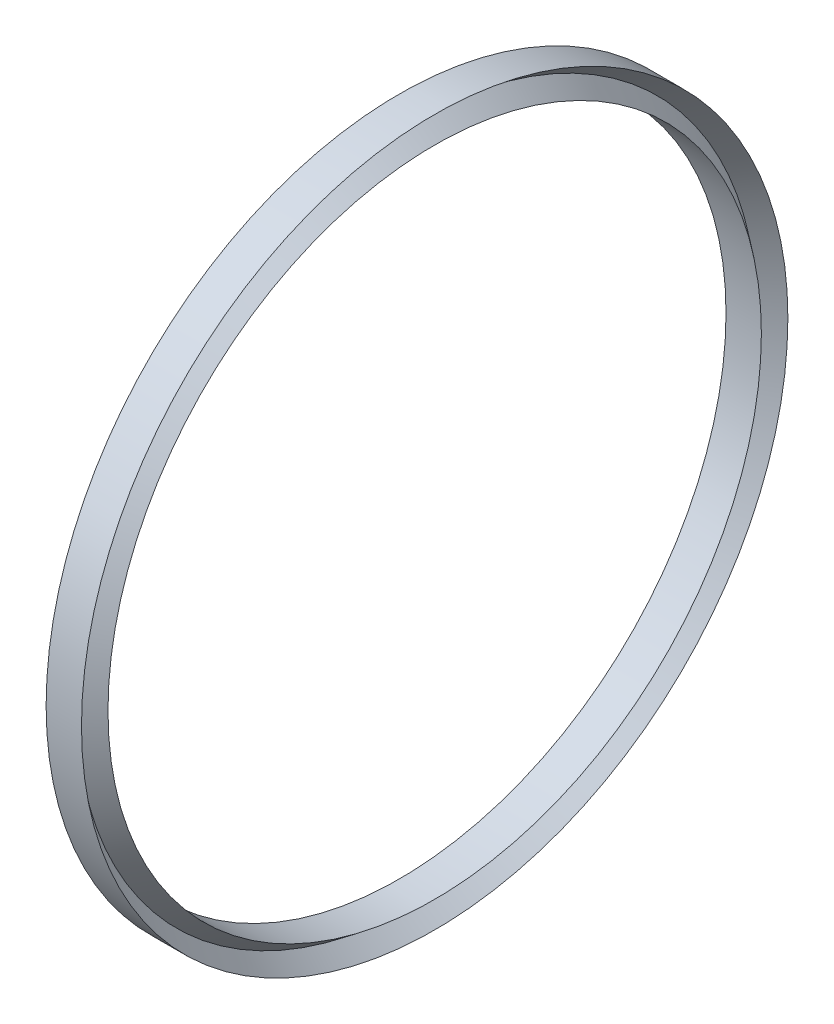
ISO-10303-21;
HEADER;
FILE_DESCRIPTION(('STEP AP214'),'2;1');
FILE_NAME('part.step','',(''),(''),'','','');
FILE_SCHEMA(('AUTOMOTIVE_DESIGN { 1 0 10303 214 1 1 1 1 }'));
ENDSEC;
DATA;
#1=APPLICATION_CONTEXT('core data for automotive mechanical design processes');
#2=APPLICATION_PROTOCOL_DEFINITION('international standard','automotive_design',2000,#1);
#3=PRODUCT_CONTEXT('',#1,'mechanical');
#4=PRODUCT('Part','Part','',(#3));
#5=PRODUCT_RELATED_PRODUCT_CATEGORY('part','',(#4));
#6=PRODUCT_DEFINITION_FORMATION('','',#4);
#7=PRODUCT_DEFINITION_CONTEXT('part definition',#1,'design');
#8=PRODUCT_DEFINITION('design','',#6,#7);
#9=PRODUCT_DEFINITION_SHAPE('','',#8);
#10=(LENGTH_UNIT() NAMED_UNIT(*) SI_UNIT(.MILLI.,.METRE.));
#11=(NAMED_UNIT(*) PLANE_ANGLE_UNIT() SI_UNIT($,.RADIAN.));
#12=(NAMED_UNIT(*) SI_UNIT($,.STERADIAN.) SOLID_ANGLE_UNIT());
#13=UNCERTAINTY_MEASURE_WITH_UNIT(LENGTH_MEASURE(1.E-05),#10,'distance_accuracy_value','');
#14=(GEOMETRIC_REPRESENTATION_CONTEXT(3) GLOBAL_UNCERTAINTY_ASSIGNED_CONTEXT((#13)) GLOBAL_UNIT_ASSIGNED_CONTEXT((#10,
#11,#12)) REPRESENTATION_CONTEXT('',''));
#15=CARTESIAN_POINT('',(0.,0.,0.));
#16=DIRECTION('',(0.,0.,1.));
#17=DIRECTION('',(1.,0.,0.));
#18=AXIS2_PLACEMENT_3D('',#15,#16,#17);
#19=CARTESIAN_POINT('',(-65.8314235751511,0.,0.));
#20=DIRECTION('',(1.,0.,0.));
#21=DIRECTION('',(0.,0.,-1.));
#22=AXIS2_PLACEMENT_3D('',#19,#20,#21);
#23=CONICAL_SURFACE('',#22,38.5,0.643501108793283);
#24=CARTESIAN_POINT('',(-63.8300902418178,0.,0.));
#25=DIRECTION('',(-1.,0.,0.));
#26=DIRECTION('',(0.,0.,1.));
#27=AXIS2_PLACEMENT_3D('',#24,#25,#26);
#28=CIRCLE('',#27,40.001);
#29=CARTESIAN_POINT('',(-63.8300902418178,0.,40.001));
#30=VERTEX_POINT('',#29);
#31=EDGE_CURVE('E10',#30,#30,#28,.T.);
#32=ORIENTED_EDGE('',*,*,#31,.F.);
#33=EDGE_LOOP('',(#32));
#34=FACE_BOUND('',#33,.T.);
#35=CARTESIAN_POINT('',(-65.8314235751511,0.,0.));
#36=DIRECTION('',(-1.,0.,0.));
#37=DIRECTION('',(0.,0.,1.));
#38=AXIS2_PLACEMENT_3D('',#35,#36,#37);
#39=CIRCLE('',#38,38.5);
#40=CARTESIAN_POINT('',(-65.8314235751511,0.,38.5));
#41=VERTEX_POINT('',#40);
#42=EDGE_CURVE('E61',#41,#41,#39,.T.);
#43=ORIENTED_EDGE('',*,*,#42,.T.);
#44=EDGE_LOOP('',(#43));
#45=FACE_BOUND('',#44,.T.);
#46=ADVANCED_FACE('F35',(#34,#45),#23,.F.);
#47=CARTESIAN_POINT('',(-81.57816751546,0.,0.));
#48=DIRECTION('',(-1.,0.,0.));
#49=DIRECTION('',(0.,0.,1.));
#50=AXIS2_PLACEMENT_3D('',#47,#48,#49);
#51=CYLINDRICAL_SURFACE('',#50,40.001);
#52=ORIENTED_EDGE('',*,*,#31,.T.);
#53=EDGE_LOOP('',(#52));
#54=FACE_BOUND('',#53,.T.);
#55=CARTESIAN_POINT('',(-67.8340902418178,0.,0.));
#56=DIRECTION('',(-1.,0.,0.));
#57=DIRECTION('',(0.,0.,1.));
#58=AXIS2_PLACEMENT_3D('',#55,#56,#57);
#59=CIRCLE('',#58,40.001);
#60=CARTESIAN_POINT('',(-67.8340902418178,0.,40.001));
#61=VERTEX_POINT('',#60);
#62=EDGE_CURVE('E42',#61,#61,#59,.T.);
#63=ORIENTED_EDGE('',*,*,#62,.F.);
#64=EDGE_LOOP('',(#63));
#65=FACE_BOUND('',#64,.T.);
#66=ADVANCED_FACE('F115',(#54,#65),#51,.T.);
#67=CARTESIAN_POINT('',(-67.8340902418178,0.,0.));
#68=DIRECTION('',(-1.,0.,0.));
#69=DIRECTION('',(0.,0.,1.));
#70=AXIS2_PLACEMENT_3D('',#67,#68,#69);
#71=PLANE('',#70);
#72=ORIENTED_EDGE('',*,*,#62,.T.);
#73=EDGE_LOOP('',(#72));
#74=FACE_BOUND('',#73,.T.);
#75=CARTESIAN_POINT('',(-67.8340902418178,0.,0.));
#76=DIRECTION('',(-1.,0.,0.));
#77=DIRECTION('',(0.,0.,1.));
#78=AXIS2_PLACEMENT_3D('',#75,#76,#77);
#79=CIRCLE('',#78,36.999);
#80=CARTESIAN_POINT('',(-67.8340902418178,0.,36.999));
#81=VERTEX_POINT('',#80);
#82=EDGE_CURVE('E49',#81,#81,#79,.T.);
#83=ORIENTED_EDGE('',*,*,#82,.F.);
#84=EDGE_LOOP('',(#83));
#85=FACE_BOUND('',#84,.T.);
#86=ADVANCED_FACE('F112',(#74,#85),#71,.T.);
#87=CARTESIAN_POINT('',(-81.57816751546,0.,0.));
#88=DIRECTION('',(-1.,0.,0.));
#89=DIRECTION('',(0.,0.,1.));
#90=AXIS2_PLACEMENT_3D('',#87,#88,#89);
#91=CYLINDRICAL_SURFACE('',#90,36.999);
#92=ORIENTED_EDGE('',*,*,#82,.T.);
#93=EDGE_LOOP('',(#92));
#94=FACE_BOUND('',#93,.T.);
#95=CARTESIAN_POINT('',(-63.8300902418178,0.,0.));
#96=DIRECTION('',(-1.,0.,0.));
#97=DIRECTION('',(0.,0.,1.));
#98=AXIS2_PLACEMENT_3D('',#95,#96,#97);
#99=CIRCLE('',#98,36.999);
#100=CARTESIAN_POINT('',(-63.8300902418178,0.,36.999));
#101=VERTEX_POINT('',#100);
#102=EDGE_CURVE('E55',#101,#101,#99,.T.);
#103=ORIENTED_EDGE('',*,*,#102,.F.);
#104=EDGE_LOOP('',(#103));
#105=FACE_BOUND('',#104,.T.);
#106=ADVANCED_FACE('F108',(#94,#105),#91,.F.);
#107=CARTESIAN_POINT('',(-63.8300902418178,0.,0.));
#108=DIRECTION('',(-1.,0.,0.));
#109=DIRECTION('',(0.,0.,1.));
#110=AXIS2_PLACEMENT_3D('',#107,#108,#109);
#111=CONICAL_SURFACE('',#110,36.999,0.643501108793283);
#112=ORIENTED_EDGE('',*,*,#42,.F.);
#113=EDGE_LOOP('',(#112));
#114=FACE_BOUND('',#113,.T.);
#115=ORIENTED_EDGE('',*,*,#102,.T.);
#116=EDGE_LOOP('',(#115));
#117=FACE_BOUND('',#116,.T.);
#118=ADVANCED_FACE('F106',(#114,#117),#111,.T.);
#119=CLOSED_SHELL('',(#46,#66,#86,#106,#118));
#120=CARTESIAN_POINT('',(-65.8330902418178,0.,0.));
#121=DIRECTION('',(1.,0.,0.));
#122=DIRECTION('',(0.,0.,-1.));
#123=AXIS2_PLACEMENT_3D('',#120,#121,#122);
#124=CONICAL_SURFACE('',#123,38.5,0.643501108793284);
#125=CARTESIAN_POINT('',(-63.8330902418178,0.,0.));
#126=DIRECTION('',(-1.,0.,0.));
#127=DIRECTION('',(0.,0.,1.));
#128=AXIS2_PLACEMENT_3D('',#125,#126,#127);
#129=CIRCLE('',#128,40.);
#130=CARTESIAN_POINT('',(-63.8330902418178,0.,40.));
#131=VERTEX_POINT('',#130);
#132=EDGE_CURVE('E65',#131,#131,#129,.T.);
#133=ORIENTED_EDGE('',*,*,#132,.T.);
#134=EDGE_LOOP('',(#133));
#135=FACE_BOUND('',#134,.T.);
#136=CARTESIAN_POINT('',(-65.8330902418178,0.,0.));
#137=DIRECTION('',(-1.,0.,0.));
#138=DIRECTION('',(0.,0.,1.));
#139=AXIS2_PLACEMENT_3D('',#136,#137,#138);
#140=CIRCLE('',#139,38.5);
#141=CARTESIAN_POINT('',(-65.8330902418178,0.,38.5));
#142=VERTEX_POINT('',#141);
#143=EDGE_CURVE('E81',#142,#142,#140,.T.);
#144=ORIENTED_EDGE('',*,*,#143,.F.);
#145=EDGE_LOOP('',(#144));
#146=FACE_BOUND('',#145,.T.);
#147=ADVANCED_FACE('F90',(#135,#146),#124,.T.);
#148=CARTESIAN_POINT('',(-81.57816751546,0.,0.));
#149=DIRECTION('',(-1.,0.,0.));
#150=DIRECTION('',(0.,0.,1.));
#151=AXIS2_PLACEMENT_3D('',#148,#149,#150);
#152=CYLINDRICAL_SURFACE('',#151,40.);
#153=ORIENTED_EDGE('',*,*,#132,.F.);
#154=EDGE_LOOP('',(#153));
#155=FACE_BOUND('',#154,.T.);
#156=CARTESIAN_POINT('',(-67.8330902418178,0.,0.));
#157=DIRECTION('',(-1.,0.,0.));
#158=DIRECTION('',(0.,0.,1.));
#159=AXIS2_PLACEMENT_3D('',#156,#157,#158);
#160=CIRCLE('',#159,40.);
#161=CARTESIAN_POINT('',(-67.8330902418178,0.,40.));
#162=VERTEX_POINT('',#161);
#163=EDGE_CURVE('E69',#162,#162,#160,.T.);
#164=ORIENTED_EDGE('',*,*,#163,.T.);
#165=EDGE_LOOP('',(#164));
#166=FACE_BOUND('',#165,.T.);
#167=ADVANCED_FACE('F92',(#155,#166),#152,.F.);
#168=CARTESIAN_POINT('',(-67.8330902418178,0.,0.));
#169=DIRECTION('',(-1.,0.,0.));
#170=DIRECTION('',(0.,0.,1.));
#171=AXIS2_PLACEMENT_3D('',#168,#169,#170);
#172=PLANE('',#171);
#173=ORIENTED_EDGE('',*,*,#163,.F.);
#174=EDGE_LOOP('',(#173));
#175=FACE_BOUND('',#174,.T.);
#176=CARTESIAN_POINT('',(-67.8330902418178,0.,0.));
#177=DIRECTION('',(-1.,0.,0.));
#178=DIRECTION('',(0.,0.,1.));
#179=AXIS2_PLACEMENT_3D('',#176,#177,#178);
#180=CIRCLE('',#179,37.);
#181=CARTESIAN_POINT('',(-67.8330902418178,0.,37.));
#182=VERTEX_POINT('',#181);
#183=EDGE_CURVE('E73',#182,#182,#180,.T.);
#184=ORIENTED_EDGE('',*,*,#183,.T.);
#185=EDGE_LOOP('',(#184));
#186=FACE_BOUND('',#185,.T.);
#187=ADVANCED_FACE('F100',(#175,#186),#172,.F.);
#188=CARTESIAN_POINT('',(-81.57816751546,0.,0.));
#189=DIRECTION('',(-1.,0.,0.));
#190=DIRECTION('',(0.,0.,1.));
#191=AXIS2_PLACEMENT_3D('',#188,#189,#190);
#192=CYLINDRICAL_SURFACE('',#191,37.);
#193=ORIENTED_EDGE('',*,*,#183,.F.);
#194=EDGE_LOOP('',(#193));
#195=FACE_BOUND('',#194,.T.);
#196=CARTESIAN_POINT('',(-63.8330902418178,0.,0.));
#197=DIRECTION('',(-1.,0.,0.));
#198=DIRECTION('',(0.,0.,1.));
#199=AXIS2_PLACEMENT_3D('',#196,#197,#198);
#200=CIRCLE('',#199,37.);
#201=CARTESIAN_POINT('',(-63.8330902418178,0.,37.));
#202=VERTEX_POINT('',#201);
#203=EDGE_CURVE('E77',#202,#202,#200,.T.);
#204=ORIENTED_EDGE('',*,*,#203,.T.);
#205=EDGE_LOOP('',(#204));
#206=FACE_BOUND('',#205,.T.);
#207=ADVANCED_FACE('F171',(#195,#206),#192,.T.);
#208=CARTESIAN_POINT('',(-63.8330902418178,0.,0.));
#209=DIRECTION('',(-1.,0.,0.));
#210=DIRECTION('',(0.,0.,1.));
#211=AXIS2_PLACEMENT_3D('',#208,#209,#210);
#212=CONICAL_SURFACE('',#211,37.,0.643501108793284);
#213=ORIENTED_EDGE('',*,*,#143,.T.);
#214=EDGE_LOOP('',(#213));
#215=FACE_BOUND('',#214,.T.);
#216=ORIENTED_EDGE('',*,*,#203,.F.);
#217=EDGE_LOOP('',(#216));
#218=FACE_BOUND('',#217,.T.);
#219=ADVANCED_FACE('F87',(#215,#218),#212,.F.);
#220=CLOSED_SHELL('',(#147,#167,#187,#207,#219));
#221=ORIENTED_CLOSED_SHELL('',*,#220,.T.);
#222=BREP_WITH_VOIDS('B2',#119,(#221));
#223=ADVANCED_BREP_SHAPE_REPRESENTATION('',(#18,#222),#14);
#224=SHAPE_DEFINITION_REPRESENTATION(#9,#223);
ENDSEC;
END-ISO-10303-21;
